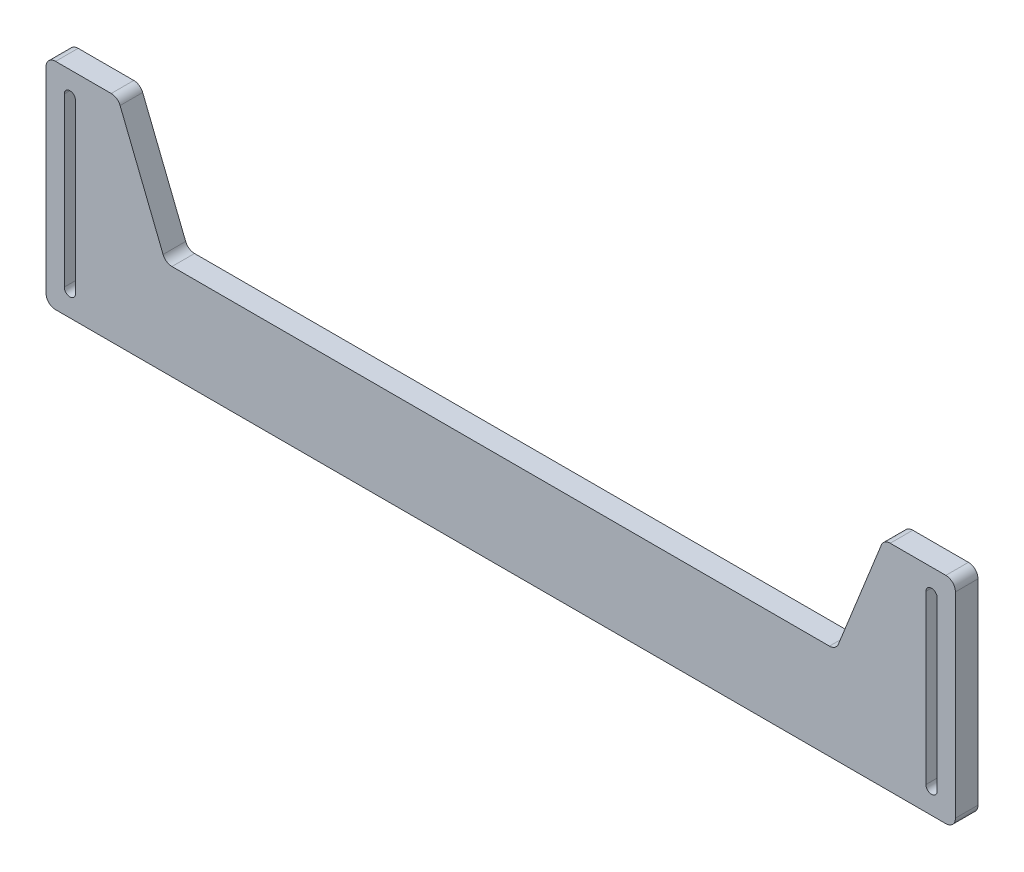
ISO-10303-21;
HEADER;
FILE_DESCRIPTION(('STEP AP214'),'2;1');
FILE_NAME('part.step','',(''),(''),'','','');
FILE_SCHEMA(('AUTOMOTIVE_DESIGN { 1 0 10303 214 1 1 1 1 }'));
ENDSEC;
DATA;
#1=APPLICATION_CONTEXT('core data for automotive mechanical design processes');
#2=APPLICATION_PROTOCOL_DEFINITION('international standard','automotive_design',2000,#1);
#3=PRODUCT_CONTEXT('',#1,'mechanical');
#4=PRODUCT('Part','Part','',(#3));
#5=PRODUCT_RELATED_PRODUCT_CATEGORY('part','',(#4));
#6=PRODUCT_DEFINITION_FORMATION('','',#4);
#7=PRODUCT_DEFINITION_CONTEXT('part definition',#1,'design');
#8=PRODUCT_DEFINITION('design','',#6,#7);
#9=PRODUCT_DEFINITION_SHAPE('','',#8);
#10=(LENGTH_UNIT() NAMED_UNIT(*) SI_UNIT(.MILLI.,.METRE.));
#11=(NAMED_UNIT(*) PLANE_ANGLE_UNIT() SI_UNIT($,.RADIAN.));
#12=(NAMED_UNIT(*) SI_UNIT($,.STERADIAN.) SOLID_ANGLE_UNIT());
#13=UNCERTAINTY_MEASURE_WITH_UNIT(LENGTH_MEASURE(1.E-05),#10,'distance_accuracy_value','');
#14=(GEOMETRIC_REPRESENTATION_CONTEXT(3) GLOBAL_UNCERTAINTY_ASSIGNED_CONTEXT((#13)) GLOBAL_UNIT_ASSIGNED_CONTEXT((#10,
#11,#12)) REPRESENTATION_CONTEXT('',''));
#15=CARTESIAN_POINT('',(0.,0.,0.));
#16=DIRECTION('',(0.,0.,1.));
#17=DIRECTION('',(1.,0.,0.));
#18=AXIS2_PLACEMENT_3D('',#15,#16,#17);
#19=CARTESIAN_POINT('',(0.,0.,3.));
#20=DIRECTION('',(0.,0.,-1.));
#21=DIRECTION('',(-1.,0.,0.));
#22=AXIS2_PLACEMENT_3D('',#19,#20,#21);
#23=PLANE('',#22);
#24=CARTESIAN_POINT('',(-114.475,22.225,3.));
#25=DIRECTION('',(0.,0.,1.));
#26=DIRECTION('',(1.,0.,0.));
#27=AXIS2_PLACEMENT_3D('',#24,#25,#26);
#28=CIRCLE('',#27,1.49999999999999);
#29=CARTESIAN_POINT('',(-112.975,22.225,3.));
#30=VERTEX_POINT('',#29);
#31=CARTESIAN_POINT('',(-115.975,22.225,3.));
#32=VERTEX_POINT('',#31);
#33=EDGE_CURVE('E515',#30,#32,#28,.T.);
#34=ORIENTED_EDGE('',*,*,#33,.F.);
#35=DIRECTION('',(0.,1.,0.));
#36=VECTOR('',#35,1.);
#37=CARTESIAN_POINT('',(-112.975,22.225,3.));
#38=LINE('',#37,#36);
#39=CARTESIAN_POINT('',(-112.975,-22.225,3.));
#40=VERTEX_POINT('',#39);
#41=EDGE_CURVE('E510',#40,#30,#38,.T.);
#42=ORIENTED_EDGE('',*,*,#41,.F.);
#43=CARTESIAN_POINT('',(-114.475,-22.225,3.));
#44=DIRECTION('',(0.,0.,1.));
#45=DIRECTION('',(1.,0.,0.));
#46=AXIS2_PLACEMENT_3D('',#43,#44,#45);
#47=CIRCLE('',#46,1.50000000000001);
#48=CARTESIAN_POINT('',(-115.975,-22.225,3.));
#49=VERTEX_POINT('',#48);
#50=EDGE_CURVE('E529',#49,#40,#47,.T.);
#51=ORIENTED_EDGE('',*,*,#50,.F.);
#52=DIRECTION('',(0.,-1.,0.));
#53=VECTOR('',#52,1.);
#54=CARTESIAN_POINT('',(-115.975,22.225,3.));
#55=LINE('',#54,#53);
#56=EDGE_CURVE('E536',#32,#49,#55,.T.);
#57=ORIENTED_EDGE('',*,*,#56,.F.);
#58=EDGE_LOOP('',(#34,#42,#51,#57));
#59=FACE_BOUND('',#58,.T.);
#60=DIRECTION('',(0.,1.,0.));
#61=VECTOR('',#60,1.);
#62=CARTESIAN_POINT('',(120.825,-28.575,3.));
#63=LINE('',#62,#61);
#64=CARTESIAN_POINT('',(120.825,-26.035,3.));
#65=VERTEX_POINT('',#64);
#66=CARTESIAN_POINT('',(120.825,26.035,3.));
#67=VERTEX_POINT('',#66);
#68=EDGE_CURVE('E260',#65,#67,#63,.T.);
#69=ORIENTED_EDGE('',*,*,#68,.T.);
#70=CARTESIAN_POINT('',(118.285,26.035,3.));
#71=DIRECTION('',(0.,0.,-1.));
#72=DIRECTION('',(-1.,0.,0.));
#73=AXIS2_PLACEMENT_3D('',#70,#71,#72);
#74=CIRCLE('',#73,2.54);
#75=CARTESIAN_POINT('',(118.285,28.575,3.));
#76=VERTEX_POINT('',#75);
#77=EDGE_CURVE('E373',#67,#76,#74,.F.);
#78=ORIENTED_EDGE('',*,*,#77,.T.);
#79=DIRECTION('',(-1.,0.,0.));
#80=VECTOR('',#79,1.);
#81=CARTESIAN_POINT('',(120.825,28.575,3.));
#82=LINE('',#81,#80);
#83=CARTESIAN_POINT('',(103.494663722024,28.575,3.));
#84=VERTEX_POINT('',#83);
#85=EDGE_CURVE('E280',#76,#84,#82,.T.);
#86=ORIENTED_EDGE('',*,*,#85,.T.);
#87=CARTESIAN_POINT('',(103.494663722024,26.035,3.));
#88=DIRECTION('',(0.,0.,-1.));
#89=DIRECTION('',(-1.,0.,0.));
#90=AXIS2_PLACEMENT_3D('',#87,#88,#89);
#91=CIRCLE('',#90,2.54);
#92=CARTESIAN_POINT('',(101.136332927176,26.9783323179394,3.));
#93=VERTEX_POINT('',#92);
#94=EDGE_CURVE('E384',#84,#93,#91,.F.);
#95=ORIENTED_EDGE('',*,*,#94,.T.);
#96=DIRECTION('',(-0.371390676354104,-0.928476690885259,0.));
#97=VECTOR('',#96,1.);
#98=CARTESIAN_POINT('',(101.775,28.575,3.));
#99=LINE('',#98,#97);
#100=CARTESIAN_POINT('',(89.7136670728242,-1.57833231793944,3.));
#101=VERTEX_POINT('',#100);
#102=EDGE_CURVE('E285',#93,#101,#99,.T.);
#103=ORIENTED_EDGE('',*,*,#102,.T.);
#104=CARTESIAN_POINT('',(87.3553362779756,-0.635000000000021,3.));
#105=DIRECTION('',(0.,0.,-1.));
#106=DIRECTION('',(-1.,0.,0.));
#107=AXIS2_PLACEMENT_3D('',#104,#105,#106);
#108=CIRCLE('',#107,2.54);
#109=CARTESIAN_POINT('',(87.3553362779756,-3.17500000000002,3.));
#110=VERTEX_POINT('',#109);
#111=EDGE_CURVE('E12',#101,#110,#108,.T.);
#112=ORIENTED_EDGE('',*,*,#111,.T.);
#113=DIRECTION('',(-1.,0.,0.));
#114=VECTOR('',#113,1.);
#115=CARTESIAN_POINT('',(-89.075,-3.17500000000002,3.));
#116=LINE('',#115,#114);
#117=CARTESIAN_POINT('',(-87.3553362779756,-3.17500000000002,3.));
#118=VERTEX_POINT('',#117);
#119=EDGE_CURVE('E293',#110,#118,#116,.T.);
#120=ORIENTED_EDGE('',*,*,#119,.T.);
#121=CARTESIAN_POINT('',(-87.3553362779756,-0.635000000000021,3.));
#122=DIRECTION('',(0.,0.,-1.));
#123=DIRECTION('',(-1.,0.,0.));
#124=AXIS2_PLACEMENT_3D('',#121,#122,#123);
#125=CIRCLE('',#124,2.54);
#126=CARTESIAN_POINT('',(-89.7136670728242,-1.57833231793944,3.));
#127=VERTEX_POINT('',#126);
#128=EDGE_CURVE('E304',#118,#127,#125,.T.);
#129=ORIENTED_EDGE('',*,*,#128,.T.);
#130=DIRECTION('',(-0.371390676354104,0.928476690885259,0.));
#131=VECTOR('',#130,1.);
#132=CARTESIAN_POINT('',(-101.775,28.575,3.));
#133=LINE('',#132,#131);
#134=CARTESIAN_POINT('',(-101.136332927176,26.9783323179394,3.));
#135=VERTEX_POINT('',#134);
#136=EDGE_CURVE('E298',#127,#135,#133,.T.);
#137=ORIENTED_EDGE('',*,*,#136,.T.);
#138=CARTESIAN_POINT('',(-103.494663722024,26.035,3.));
#139=DIRECTION('',(0.,0.,-1.));
#140=DIRECTION('',(-1.,0.,0.));
#141=AXIS2_PLACEMENT_3D('',#138,#139,#140);
#142=CIRCLE('',#141,2.54);
#143=CARTESIAN_POINT('',(-103.494663722024,28.575,3.));
#144=VERTEX_POINT('',#143);
#145=EDGE_CURVE('E381',#135,#144,#142,.F.);
#146=ORIENTED_EDGE('',*,*,#145,.T.);
#147=DIRECTION('',(-1.,0.,0.));
#148=VECTOR('',#147,1.);
#149=CARTESIAN_POINT('',(-120.825,28.575,3.));
#150=LINE('',#149,#148);
#151=CARTESIAN_POINT('',(-118.285,28.575,3.));
#152=VERTEX_POINT('',#151);
#153=EDGE_CURVE('E456',#144,#152,#150,.T.);
#154=ORIENTED_EDGE('',*,*,#153,.T.);
#155=CARTESIAN_POINT('',(-118.285,26.035,3.));
#156=DIRECTION('',(0.,0.,-1.));
#157=DIRECTION('',(-1.,0.,0.));
#158=AXIS2_PLACEMENT_3D('',#155,#156,#157);
#159=CIRCLE('',#158,2.54);
#160=CARTESIAN_POINT('',(-120.825,26.035,3.));
#161=VERTEX_POINT('',#160);
#162=EDGE_CURVE('E387',#152,#161,#159,.F.);
#163=ORIENTED_EDGE('',*,*,#162,.T.);
#164=DIRECTION('',(0.,-1.,0.));
#165=VECTOR('',#164,1.);
#166=CARTESIAN_POINT('',(-120.825,-28.575,3.));
#167=LINE('',#166,#165);
#168=CARTESIAN_POINT('',(-120.825,-26.035,3.));
#169=VERTEX_POINT('',#168);
#170=EDGE_CURVE('E261',#161,#169,#167,.T.);
#171=ORIENTED_EDGE('',*,*,#170,.T.);
#172=CARTESIAN_POINT('',(-118.285,-26.035,3.));
#173=DIRECTION('',(0.,0.,-1.));
#174=DIRECTION('',(-1.,0.,0.));
#175=AXIS2_PLACEMENT_3D('',#172,#173,#174);
#176=CIRCLE('',#175,2.54);
#177=CARTESIAN_POINT('',(-118.285,-28.575,3.));
#178=VERTEX_POINT('',#177);
#179=EDGE_CURVE('E72',#169,#178,#176,.F.);
#180=ORIENTED_EDGE('',*,*,#179,.T.);
#181=DIRECTION('',(1.,0.,0.));
#182=VECTOR('',#181,1.);
#183=CARTESIAN_POINT('',(-120.825,-28.575,3.));
#184=LINE('',#183,#182);
#185=CARTESIAN_POINT('',(118.285,-28.575,3.));
#186=VERTEX_POINT('',#185);
#187=EDGE_CURVE('E256',#178,#186,#184,.T.);
#188=ORIENTED_EDGE('',*,*,#187,.T.);
#189=CARTESIAN_POINT('',(118.285,-26.035,3.));
#190=DIRECTION('',(0.,0.,-1.));
#191=DIRECTION('',(-1.,0.,0.));
#192=AXIS2_PLACEMENT_3D('',#189,#190,#191);
#193=CIRCLE('',#192,2.54);
#194=EDGE_CURVE('E376',#186,#65,#193,.F.);
#195=ORIENTED_EDGE('',*,*,#194,.T.);
#196=EDGE_LOOP('',(#69,#78,#86,#95,#103,#112,#120,#129,#137,#146,#154,#163,#171,#180,#188,#195));
#197=FACE_BOUND('',#196,.T.);
#198=CARTESIAN_POINT('',(114.475,22.225,3.));
#199=DIRECTION('',(0.,0.,1.));
#200=DIRECTION('',(1.,0.,0.));
#201=AXIS2_PLACEMENT_3D('',#198,#199,#200);
#202=CIRCLE('',#201,1.49999999999999);
#203=CARTESIAN_POINT('',(115.975,22.225,3.));
#204=VERTEX_POINT('',#203);
#205=CARTESIAN_POINT('',(112.975,22.225,3.));
#206=VERTEX_POINT('',#205);
#207=EDGE_CURVE('E213',#204,#206,#202,.T.);
#208=ORIENTED_EDGE('',*,*,#207,.F.);
#209=DIRECTION('',(0.,1.,0.));
#210=VECTOR('',#209,1.);
#211=CARTESIAN_POINT('',(115.975,22.225,3.));
#212=LINE('',#211,#210);
#213=CARTESIAN_POINT('',(115.975,-22.225,3.));
#214=VERTEX_POINT('',#213);
#215=EDGE_CURVE('E241',#214,#204,#212,.T.);
#216=ORIENTED_EDGE('',*,*,#215,.F.);
#217=CARTESIAN_POINT('',(114.475,-22.225,3.));
#218=DIRECTION('',(0.,0.,1.));
#219=DIRECTION('',(1.,0.,0.));
#220=AXIS2_PLACEMENT_3D('',#217,#218,#219);
#221=CIRCLE('',#220,1.50000000000001);
#222=CARTESIAN_POINT('',(112.975,-22.225,3.));
#223=VERTEX_POINT('',#222);
#224=EDGE_CURVE('E238',#223,#214,#221,.T.);
#225=ORIENTED_EDGE('',*,*,#224,.F.);
#226=DIRECTION('',(0.,-1.,0.));
#227=VECTOR('',#226,1.);
#228=CARTESIAN_POINT('',(112.975,22.225,3.));
#229=LINE('',#228,#227);
#230=EDGE_CURVE('E224',#206,#223,#229,.T.);
#231=ORIENTED_EDGE('',*,*,#230,.F.);
#232=EDGE_LOOP('',(#208,#216,#225,#231));
#233=FACE_BOUND('',#232,.T.);
#234=ADVANCED_FACE('F48',(#59,#197,#233),#23,.F.);
#235=CARTESIAN_POINT('',(0.,0.,-3.));
#236=DIRECTION('',(0.,0.,-1.));
#237=DIRECTION('',(-1.,0.,0.));
#238=AXIS2_PLACEMENT_3D('',#235,#236,#237);
#239=PLANE('',#238);
#240=DIRECTION('',(-1.,0.,0.));
#241=VECTOR('',#240,1.);
#242=CARTESIAN_POINT('',(120.825,28.575,-3.));
#243=LINE('',#242,#241);
#244=CARTESIAN_POINT('',(118.285,28.575,-3.));
#245=VERTEX_POINT('',#244);
#246=CARTESIAN_POINT('',(103.494663722024,28.575,-3.));
#247=VERTEX_POINT('',#246);
#248=EDGE_CURVE('E269',#245,#247,#243,.T.);
#249=ORIENTED_EDGE('',*,*,#248,.F.);
#250=CARTESIAN_POINT('',(118.285,26.035,-3.));
#251=DIRECTION('',(0.,0.,-1.));
#252=DIRECTION('',(-1.,0.,0.));
#253=AXIS2_PLACEMENT_3D('',#250,#251,#252);
#254=CIRCLE('',#253,2.54);
#255=CARTESIAN_POINT('',(120.825,26.035,-3.));
#256=VERTEX_POINT('',#255);
#257=EDGE_CURVE('E397',#245,#256,#254,.T.);
#258=ORIENTED_EDGE('',*,*,#257,.T.);
#259=DIRECTION('',(0.,1.,0.));
#260=VECTOR('',#259,1.);
#261=CARTESIAN_POINT('',(120.825,-28.575,-3.));
#262=LINE('',#261,#260);
#263=CARTESIAN_POINT('',(120.825,-26.035,-3.));
#264=VERTEX_POINT('',#263);
#265=EDGE_CURVE('E286',#264,#256,#262,.T.);
#266=ORIENTED_EDGE('',*,*,#265,.F.);
#267=CARTESIAN_POINT('',(118.285,-26.035,-3.));
#268=DIRECTION('',(0.,0.,-1.));
#269=DIRECTION('',(-1.,0.,0.));
#270=AXIS2_PLACEMENT_3D('',#267,#268,#269);
#271=CIRCLE('',#270,2.54);
#272=CARTESIAN_POINT('',(118.285,-28.575,-3.));
#273=VERTEX_POINT('',#272);
#274=EDGE_CURVE('E400',#264,#273,#271,.T.);
#275=ORIENTED_EDGE('',*,*,#274,.T.);
#276=DIRECTION('',(1.,0.,0.));
#277=VECTOR('',#276,1.);
#278=CARTESIAN_POINT('',(-120.825,-28.575,-3.));
#279=LINE('',#278,#277);
#280=CARTESIAN_POINT('',(-118.285,-28.575,-3.));
#281=VERTEX_POINT('',#280);
#282=EDGE_CURVE('E424',#281,#273,#279,.T.);
#283=ORIENTED_EDGE('',*,*,#282,.F.);
#284=CARTESIAN_POINT('',(-118.285,-26.035,-3.));
#285=DIRECTION('',(0.,0.,-1.));
#286=DIRECTION('',(-1.,0.,0.));
#287=AXIS2_PLACEMENT_3D('',#284,#285,#286);
#288=CIRCLE('',#287,2.54);
#289=CARTESIAN_POINT('',(-120.825,-26.035,-3.));
#290=VERTEX_POINT('',#289);
#291=EDGE_CURVE('E403',#281,#290,#288,.T.);
#292=ORIENTED_EDGE('',*,*,#291,.T.);
#293=DIRECTION('',(0.,-1.,0.));
#294=VECTOR('',#293,1.);
#295=CARTESIAN_POINT('',(-120.825,-28.575,-3.));
#296=LINE('',#295,#294);
#297=CARTESIAN_POINT('',(-120.825,26.035,-3.));
#298=VERTEX_POINT('',#297);
#299=EDGE_CURVE('E427',#298,#290,#296,.T.);
#300=ORIENTED_EDGE('',*,*,#299,.F.);
#301=CARTESIAN_POINT('',(-118.285,26.035,-3.));
#302=DIRECTION('',(0.,0.,-1.));
#303=DIRECTION('',(-1.,0.,0.));
#304=AXIS2_PLACEMENT_3D('',#301,#302,#303);
#305=CIRCLE('',#304,2.54);
#306=CARTESIAN_POINT('',(-118.285,28.575,-3.));
#307=VERTEX_POINT('',#306);
#308=EDGE_CURVE('E412',#298,#307,#305,.T.);
#309=ORIENTED_EDGE('',*,*,#308,.T.);
#310=DIRECTION('',(-1.,0.,0.));
#311=VECTOR('',#310,1.);
#312=CARTESIAN_POINT('',(-120.825,28.575,-3.));
#313=LINE('',#312,#311);
#314=CARTESIAN_POINT('',(-103.494663722024,28.575,-3.));
#315=VERTEX_POINT('',#314);
#316=EDGE_CURVE('E431',#315,#307,#313,.T.);
#317=ORIENTED_EDGE('',*,*,#316,.F.);
#318=CARTESIAN_POINT('',(-103.494663722024,26.035,-3.));
#319=DIRECTION('',(0.,0.,-1.));
#320=DIRECTION('',(-1.,0.,0.));
#321=AXIS2_PLACEMENT_3D('',#318,#319,#320);
#322=CIRCLE('',#321,2.54);
#323=CARTESIAN_POINT('',(-101.136332927176,26.9783323179394,-3.));
#324=VERTEX_POINT('',#323);
#325=EDGE_CURVE('E406',#315,#324,#322,.T.);
#326=ORIENTED_EDGE('',*,*,#325,.T.);
#327=DIRECTION('',(-0.371390676354104,0.928476690885259,0.));
#328=VECTOR('',#327,1.);
#329=CARTESIAN_POINT('',(-101.775,28.575,-3.));
#330=LINE('',#329,#328);
#331=CARTESIAN_POINT('',(-89.7136670728242,-1.57833231793944,-3.));
#332=VERTEX_POINT('',#331);
#333=EDGE_CURVE('E435',#332,#324,#330,.T.);
#334=ORIENTED_EDGE('',*,*,#333,.F.);
#335=CARTESIAN_POINT('',(-87.3553362779756,-0.635000000000021,-3.));
#336=DIRECTION('',(0.,0.,-1.));
#337=DIRECTION('',(-1.,0.,0.));
#338=AXIS2_PLACEMENT_3D('',#335,#336,#337);
#339=CIRCLE('',#338,2.54);
#340=CARTESIAN_POINT('',(-87.3553362779756,-3.17500000000002,-3.));
#341=VERTEX_POINT('',#340);
#342=EDGE_CURVE('E308',#332,#341,#339,.F.);
#343=ORIENTED_EDGE('',*,*,#342,.T.);
#344=DIRECTION('',(-1.,0.,0.));
#345=VECTOR('',#344,1.);
#346=CARTESIAN_POINT('',(-89.075,-3.17500000000002,-3.));
#347=LINE('',#346,#345);
#348=CARTESIAN_POINT('',(87.3553362779756,-3.17500000000002,-3.));
#349=VERTEX_POINT('',#348);
#350=EDGE_CURVE('E320',#349,#341,#347,.T.);
#351=ORIENTED_EDGE('',*,*,#350,.F.);
#352=CARTESIAN_POINT('',(87.3553362779756,-0.635000000000021,-3.));
#353=DIRECTION('',(0.,0.,-1.));
#354=DIRECTION('',(-1.,0.,0.));
#355=AXIS2_PLACEMENT_3D('',#352,#353,#354);
#356=CIRCLE('',#355,2.54);
#357=CARTESIAN_POINT('',(89.7136670728242,-1.57833231793944,-3.));
#358=VERTEX_POINT('',#357);
#359=EDGE_CURVE('E58',#349,#358,#356,.F.);
#360=ORIENTED_EDGE('',*,*,#359,.T.);
#361=DIRECTION('',(-0.371390676354104,-0.928476690885259,0.));
#362=VECTOR('',#361,1.);
#363=CARTESIAN_POINT('',(101.775,28.575,-3.));
#364=LINE('',#363,#362);
#365=CARTESIAN_POINT('',(101.136332927176,26.9783323179394,-3.));
#366=VERTEX_POINT('',#365);
#367=EDGE_CURVE('E318',#366,#358,#364,.T.);
#368=ORIENTED_EDGE('',*,*,#367,.F.);
#369=CARTESIAN_POINT('',(103.494663722024,26.035,-3.));
#370=DIRECTION('',(0.,0.,-1.));
#371=DIRECTION('',(-1.,0.,0.));
#372=AXIS2_PLACEMENT_3D('',#369,#370,#371);
#373=CIRCLE('',#372,2.54);
#374=EDGE_CURVE('E409',#366,#247,#373,.T.);
#375=ORIENTED_EDGE('',*,*,#374,.T.);
#376=EDGE_LOOP('',(#249,#258,#266,#275,#283,#292,#300,#309,#317,#326,#334,#343,#351,#360,#368,#375));
#377=FACE_BOUND('',#376,.T.);
#378=DIRECTION('',(0.,1.,0.));
#379=VECTOR('',#378,1.);
#380=CARTESIAN_POINT('',(-112.975,22.225,-3.));
#381=LINE('',#380,#379);
#382=CARTESIAN_POINT('',(-112.975,-22.225,-3.));
#383=VERTEX_POINT('',#382);
#384=CARTESIAN_POINT('',(-112.975,22.225,-3.));
#385=VERTEX_POINT('',#384);
#386=EDGE_CURVE('E511',#383,#385,#381,.T.);
#387=ORIENTED_EDGE('',*,*,#386,.T.);
#388=CARTESIAN_POINT('',(-114.475,22.225,-3.));
#389=DIRECTION('',(0.,0.,1.));
#390=DIRECTION('',(1.,0.,0.));
#391=AXIS2_PLACEMENT_3D('',#388,#389,#390);
#392=CIRCLE('',#391,1.49999999999999);
#393=CARTESIAN_POINT('',(-115.975,22.225,-3.));
#394=VERTEX_POINT('',#393);
#395=EDGE_CURVE('E233',#385,#394,#392,.T.);
#396=ORIENTED_EDGE('',*,*,#395,.T.);
#397=DIRECTION('',(0.,-1.,0.));
#398=VECTOR('',#397,1.);
#399=CARTESIAN_POINT('',(-115.975,22.225,-3.));
#400=LINE('',#399,#398);
#401=CARTESIAN_POINT('',(-115.975,-22.225,-3.));
#402=VERTEX_POINT('',#401);
#403=EDGE_CURVE('E520',#394,#402,#400,.T.);
#404=ORIENTED_EDGE('',*,*,#403,.T.);
#405=CARTESIAN_POINT('',(-114.475,-22.225,-3.));
#406=DIRECTION('',(0.,0.,1.));
#407=DIRECTION('',(1.,0.,0.));
#408=AXIS2_PLACEMENT_3D('',#405,#406,#407);
#409=CIRCLE('',#408,1.50000000000001);
#410=EDGE_CURVE('E516',#402,#383,#409,.T.);
#411=ORIENTED_EDGE('',*,*,#410,.T.);
#412=EDGE_LOOP('',(#387,#396,#404,#411));
#413=FACE_BOUND('',#412,.T.);
#414=DIRECTION('',(0.,1.,0.));
#415=VECTOR('',#414,1.);
#416=CARTESIAN_POINT('',(115.975,22.225,-3.));
#417=LINE('',#416,#415);
#418=CARTESIAN_POINT('',(115.975,-22.225,-3.));
#419=VERTEX_POINT('',#418);
#420=CARTESIAN_POINT('',(115.975,22.225,-3.));
#421=VERTEX_POINT('',#420);
#422=EDGE_CURVE('E225',#419,#421,#417,.T.);
#423=ORIENTED_EDGE('',*,*,#422,.T.);
#424=CARTESIAN_POINT('',(114.475,22.225,-3.));
#425=DIRECTION('',(0.,0.,1.));
#426=DIRECTION('',(1.,0.,0.));
#427=AXIS2_PLACEMENT_3D('',#424,#425,#426);
#428=CIRCLE('',#427,1.49999999999999);
#429=CARTESIAN_POINT('',(112.975,22.225,-3.));
#430=VERTEX_POINT('',#429);
#431=EDGE_CURVE('E786',#421,#430,#428,.T.);
#432=ORIENTED_EDGE('',*,*,#431,.T.);
#433=DIRECTION('',(0.,-1.,0.));
#434=VECTOR('',#433,1.);
#435=CARTESIAN_POINT('',(112.975,22.225,-3.));
#436=LINE('',#435,#434);
#437=CARTESIAN_POINT('',(112.975,-22.225,-3.));
#438=VERTEX_POINT('',#437);
#439=EDGE_CURVE('E231',#430,#438,#436,.T.);
#440=ORIENTED_EDGE('',*,*,#439,.T.);
#441=CARTESIAN_POINT('',(114.475,-22.225,-3.));
#442=DIRECTION('',(0.,0.,1.));
#443=DIRECTION('',(1.,0.,0.));
#444=AXIS2_PLACEMENT_3D('',#441,#442,#443);
#445=CIRCLE('',#444,1.50000000000001);
#446=EDGE_CURVE('E780',#438,#419,#445,.T.);
#447=ORIENTED_EDGE('',*,*,#446,.T.);
#448=EDGE_LOOP('',(#423,#432,#440,#447));
#449=FACE_BOUND('',#448,.T.);
#450=ADVANCED_FACE('F316',(#377,#413,#449),#239,.T.);
#451=CARTESIAN_POINT('',(120.825,28.575,3.));
#452=DIRECTION('',(0.,-1.,0.));
#453=DIRECTION('',(0.,0.,-1.));
#454=AXIS2_PLACEMENT_3D('',#451,#452,#453);
#455=PLANE('',#454);
#456=ORIENTED_EDGE('',*,*,#85,.F.);
#457=DIRECTION('',(0.,0.,-1.));
#458=VECTOR('',#457,1.);
#459=CARTESIAN_POINT('',(118.285,28.575,3.));
#460=LINE('',#459,#458);
#461=EDGE_CURVE('E415',#76,#245,#460,.T.);
#462=ORIENTED_EDGE('',*,*,#461,.T.);
#463=ORIENTED_EDGE('',*,*,#248,.T.);
#464=DIRECTION('',(0.,0.,-1.));
#465=VECTOR('',#464,1.);
#466=CARTESIAN_POINT('',(103.494663722024,28.575,3.));
#467=LINE('',#466,#465);
#468=EDGE_CURVE('E268',#247,#84,#467,.F.);
#469=ORIENTED_EDGE('',*,*,#468,.T.);
#470=EDGE_LOOP('',(#456,#462,#463,#469));
#471=FACE_BOUND('',#470,.T.);
#472=ADVANCED_FACE('F489',(#471),#455,.F.);
#473=CARTESIAN_POINT('',(101.775,28.575,3.));
#474=DIRECTION('',(0.928476690885259,-0.371390676354104,0.));
#475=DIRECTION('',(0.371390676354104,0.928476690885259,0.));
#476=AXIS2_PLACEMENT_3D('',#473,#474,#475);
#477=PLANE('',#476);
#478=ORIENTED_EDGE('',*,*,#367,.T.);
#479=DIRECTION('',(0.,0.,-1.));
#480=VECTOR('',#479,1.);
#481=CARTESIAN_POINT('',(89.7136670728242,-1.57833231793945,3.));
#482=LINE('',#481,#480);
#483=EDGE_CURVE('E329',#358,#101,#482,.F.);
#484=ORIENTED_EDGE('',*,*,#483,.T.);
#485=ORIENTED_EDGE('',*,*,#102,.F.);
#486=DIRECTION('',(0.,0.,-1.));
#487=VECTOR('',#486,1.);
#488=CARTESIAN_POINT('',(101.136332927176,26.9783323179394,3.));
#489=LINE('',#488,#487);
#490=EDGE_CURVE('E331',#93,#366,#489,.T.);
#491=ORIENTED_EDGE('',*,*,#490,.T.);
#492=EDGE_LOOP('',(#478,#484,#485,#491));
#493=FACE_BOUND('',#492,.T.);
#494=ADVANCED_FACE('F327',(#493),#477,.F.);
#495=CARTESIAN_POINT('',(-89.075,-3.17500000000002,3.));
#496=DIRECTION('',(0.,-1.,0.));
#497=DIRECTION('',(0.,0.,-1.));
#498=AXIS2_PLACEMENT_3D('',#495,#496,#497);
#499=PLANE('',#498);
#500=ORIENTED_EDGE('',*,*,#350,.T.);
#501=DIRECTION('',(0.,0.,-1.));
#502=VECTOR('',#501,1.);
#503=CARTESIAN_POINT('',(-87.3553362779756,-3.17500000000002,3.));
#504=LINE('',#503,#502);
#505=EDGE_CURVE('E338',#341,#118,#504,.F.);
#506=ORIENTED_EDGE('',*,*,#505,.T.);
#507=ORIENTED_EDGE('',*,*,#119,.F.);
#508=DIRECTION('',(0.,0.,-1.));
#509=VECTOR('',#508,1.);
#510=CARTESIAN_POINT('',(87.3553362779756,-3.17500000000002,-3.));
#511=LINE('',#510,#509);
#512=EDGE_CURVE('E343',#110,#349,#511,.T.);
#513=ORIENTED_EDGE('',*,*,#512,.T.);
#514=EDGE_LOOP('',(#500,#506,#507,#513));
#515=FACE_BOUND('',#514,.T.);
#516=ADVANCED_FACE('F442',(#515),#499,.F.);
#517=CARTESIAN_POINT('',(-101.775,28.575,3.));
#518=DIRECTION('',(-0.928476690885259,-0.371390676354104,0.));
#519=DIRECTION('',(0.371390676354104,-0.928476690885259,0.));
#520=AXIS2_PLACEMENT_3D('',#517,#518,#519);
#521=PLANE('',#520);
#522=ORIENTED_EDGE('',*,*,#333,.T.);
#523=DIRECTION('',(0.,0.,-1.));
#524=VECTOR('',#523,1.);
#525=CARTESIAN_POINT('',(-101.136332927176,26.9783323179394,3.));
#526=LINE('',#525,#524);
#527=EDGE_CURVE('E346',#324,#135,#526,.F.);
#528=ORIENTED_EDGE('',*,*,#527,.T.);
#529=ORIENTED_EDGE('',*,*,#136,.F.);
#530=DIRECTION('',(0.,0.,-1.));
#531=VECTOR('',#530,1.);
#532=CARTESIAN_POINT('',(-89.7136670728242,-1.57833231793945,-3.));
#533=LINE('',#532,#531);
#534=EDGE_CURVE('E349',#127,#332,#533,.T.);
#535=ORIENTED_EDGE('',*,*,#534,.T.);
#536=EDGE_LOOP('',(#522,#528,#529,#535));
#537=FACE_BOUND('',#536,.T.);
#538=ADVANCED_FACE('F452',(#537),#521,.F.);
#539=CARTESIAN_POINT('',(-120.825,28.575,3.));
#540=DIRECTION('',(0.,-1.,0.));
#541=DIRECTION('',(0.,0.,-1.));
#542=AXIS2_PLACEMENT_3D('',#539,#540,#541);
#543=PLANE('',#542);
#544=ORIENTED_EDGE('',*,*,#153,.F.);
#545=DIRECTION('',(0.,0.,-1.));
#546=VECTOR('',#545,1.);
#547=CARTESIAN_POINT('',(-103.494663722024,28.575,3.));
#548=LINE('',#547,#546);
#549=EDGE_CURVE('E353',#144,#315,#548,.T.);
#550=ORIENTED_EDGE('',*,*,#549,.T.);
#551=ORIENTED_EDGE('',*,*,#316,.T.);
#552=DIRECTION('',(0.,0.,-1.));
#553=VECTOR('',#552,1.);
#554=CARTESIAN_POINT('',(-118.285,28.575,3.));
#555=LINE('',#554,#553);
#556=EDGE_CURVE('E357',#307,#152,#555,.F.);
#557=ORIENTED_EDGE('',*,*,#556,.T.);
#558=EDGE_LOOP('',(#544,#550,#551,#557));
#559=FACE_BOUND('',#558,.T.);
#560=ADVANCED_FACE('F579',(#559),#543,.F.);
#561=CARTESIAN_POINT('',(-120.825,-28.575,3.));
#562=DIRECTION('',(1.,0.,0.));
#563=DIRECTION('',(0.,0.,-1.));
#564=AXIS2_PLACEMENT_3D('',#561,#562,#563);
#565=PLANE('',#564);
#566=ORIENTED_EDGE('',*,*,#299,.T.);
#567=DIRECTION('',(0.,0.,-1.));
#568=VECTOR('',#567,1.);
#569=CARTESIAN_POINT('',(-120.825,-26.035,3.));
#570=LINE('',#569,#568);
#571=EDGE_CURVE('E360',#290,#169,#570,.F.);
#572=ORIENTED_EDGE('',*,*,#571,.T.);
#573=ORIENTED_EDGE('',*,*,#170,.F.);
#574=DIRECTION('',(0.,0.,-1.));
#575=VECTOR('',#574,1.);
#576=CARTESIAN_POINT('',(-120.825,26.035,3.));
#577=LINE('',#576,#575);
#578=EDGE_CURVE('E363',#161,#298,#577,.T.);
#579=ORIENTED_EDGE('',*,*,#578,.T.);
#580=EDGE_LOOP('',(#566,#572,#573,#579));
#581=FACE_BOUND('',#580,.T.);
#582=ADVANCED_FACE('F576',(#581),#565,.F.);
#583=CARTESIAN_POINT('',(-120.825,-28.575,3.));
#584=DIRECTION('',(0.,1.,0.));
#585=DIRECTION('',(0.,0.,1.));
#586=AXIS2_PLACEMENT_3D('',#583,#584,#585);
#587=PLANE('',#586);
#588=ORIENTED_EDGE('',*,*,#282,.T.);
#589=DIRECTION('',(0.,0.,-1.));
#590=VECTOR('',#589,1.);
#591=CARTESIAN_POINT('',(118.285,-28.575,3.));
#592=LINE('',#591,#590);
#593=EDGE_CURVE('E65',#273,#186,#592,.F.);
#594=ORIENTED_EDGE('',*,*,#593,.T.);
#595=ORIENTED_EDGE('',*,*,#187,.F.);
#596=DIRECTION('',(0.,0.,-1.));
#597=VECTOR('',#596,1.);
#598=CARTESIAN_POINT('',(-118.285,-28.575,3.));
#599=LINE('',#598,#597);
#600=EDGE_CURVE('E369',#178,#281,#599,.T.);
#601=ORIENTED_EDGE('',*,*,#600,.T.);
#602=EDGE_LOOP('',(#588,#594,#595,#601));
#603=FACE_BOUND('',#602,.T.);
#604=ADVANCED_FACE('F471',(#603),#587,.F.);
#605=CARTESIAN_POINT('',(120.825,-28.575,3.));
#606=DIRECTION('',(-1.,0.,0.));
#607=DIRECTION('',(0.,0.,1.));
#608=AXIS2_PLACEMENT_3D('',#605,#606,#607);
#609=PLANE('',#608);
#610=ORIENTED_EDGE('',*,*,#265,.T.);
#611=DIRECTION('',(0.,0.,-1.));
#612=VECTOR('',#611,1.);
#613=CARTESIAN_POINT('',(120.825,26.035,3.));
#614=LINE('',#613,#612);
#615=EDGE_CURVE('E390',#256,#67,#614,.F.);
#616=ORIENTED_EDGE('',*,*,#615,.T.);
#617=ORIENTED_EDGE('',*,*,#68,.F.);
#618=DIRECTION('',(0.,0.,-1.));
#619=VECTOR('',#618,1.);
#620=CARTESIAN_POINT('',(120.825,-26.035,3.));
#621=LINE('',#620,#619);
#622=EDGE_CURVE('E393',#65,#264,#621,.T.);
#623=ORIENTED_EDGE('',*,*,#622,.T.);
#624=EDGE_LOOP('',(#610,#616,#617,#623));
#625=FACE_BOUND('',#624,.T.);
#626=ADVANCED_FACE('F480',(#625),#609,.F.);
#627=CARTESIAN_POINT('',(-114.475,22.225,3.));
#628=DIRECTION('',(0.,0.,-1.));
#629=DIRECTION('',(-1.,0.,0.));
#630=AXIS2_PLACEMENT_3D('',#627,#628,#629);
#631=CYLINDRICAL_SURFACE('',#630,1.49999999999999);
#632=ORIENTED_EDGE('',*,*,#395,.F.);
#633=DIRECTION('',(0.,0.,-1.));
#634=VECTOR('',#633,1.);
#635=CARTESIAN_POINT('',(-112.975,22.225,3.));
#636=LINE('',#635,#634);
#637=EDGE_CURVE('E504',#30,#385,#636,.T.);
#638=ORIENTED_EDGE('',*,*,#637,.F.);
#639=ORIENTED_EDGE('',*,*,#33,.T.);
#640=DIRECTION('',(0.,0.,-1.));
#641=VECTOR('',#640,1.);
#642=CARTESIAN_POINT('',(-115.975,22.225,3.));
#643=LINE('',#642,#641);
#644=EDGE_CURVE('E287',#32,#394,#643,.T.);
#645=ORIENTED_EDGE('',*,*,#644,.T.);
#646=EDGE_LOOP('',(#632,#638,#639,#645));
#647=FACE_BOUND('',#646,.T.);
#648=ADVANCED_FACE('F553',(#647),#631,.F.);
#649=CARTESIAN_POINT('',(-115.975,22.225,3.));
#650=DIRECTION('',(1.,0.,0.));
#651=DIRECTION('',(0.,1.,0.));
#652=AXIS2_PLACEMENT_3D('',#649,#650,#651);
#653=PLANE('',#652);
#654=ORIENTED_EDGE('',*,*,#403,.F.);
#655=ORIENTED_EDGE('',*,*,#644,.F.);
#656=ORIENTED_EDGE('',*,*,#56,.T.);
#657=DIRECTION('',(0.,0.,-1.));
#658=VECTOR('',#657,1.);
#659=CARTESIAN_POINT('',(-115.975,-22.225,3.));
#660=LINE('',#659,#658);
#661=EDGE_CURVE('E494',#49,#402,#660,.T.);
#662=ORIENTED_EDGE('',*,*,#661,.T.);
#663=EDGE_LOOP('',(#654,#655,#656,#662));
#664=FACE_BOUND('',#663,.T.);
#665=ADVANCED_FACE('F555',(#664),#653,.T.);
#666=CARTESIAN_POINT('',(-114.475,-22.225,3.));
#667=DIRECTION('',(0.,0.,-1.));
#668=DIRECTION('',(-1.,0.,0.));
#669=AXIS2_PLACEMENT_3D('',#666,#667,#668);
#670=CYLINDRICAL_SURFACE('',#669,1.50000000000001);
#671=ORIENTED_EDGE('',*,*,#410,.F.);
#672=ORIENTED_EDGE('',*,*,#661,.F.);
#673=ORIENTED_EDGE('',*,*,#50,.T.);
#674=DIRECTION('',(0.,0.,-1.));
#675=VECTOR('',#674,1.);
#676=CARTESIAN_POINT('',(-112.975,-22.225,3.));
#677=LINE('',#676,#675);
#678=EDGE_CURVE('E499',#40,#383,#677,.T.);
#679=ORIENTED_EDGE('',*,*,#678,.T.);
#680=EDGE_LOOP('',(#671,#672,#673,#679));
#681=FACE_BOUND('',#680,.T.);
#682=ADVANCED_FACE('F546',(#681),#670,.F.);
#683=CARTESIAN_POINT('',(-112.975,22.225,3.));
#684=DIRECTION('',(-1.,0.,0.));
#685=DIRECTION('',(0.,-1.,0.));
#686=AXIS2_PLACEMENT_3D('',#683,#684,#685);
#687=PLANE('',#686);
#688=ORIENTED_EDGE('',*,*,#386,.F.);
#689=ORIENTED_EDGE('',*,*,#678,.F.);
#690=ORIENTED_EDGE('',*,*,#41,.T.);
#691=ORIENTED_EDGE('',*,*,#637,.T.);
#692=EDGE_LOOP('',(#688,#689,#690,#691));
#693=FACE_BOUND('',#692,.T.);
#694=ADVANCED_FACE('F552',(#693),#687,.T.);
#695=CARTESIAN_POINT('',(114.475,22.225,3.));
#696=DIRECTION('',(0.,0.,-1.));
#697=DIRECTION('',(-1.,0.,0.));
#698=AXIS2_PLACEMENT_3D('',#695,#696,#697);
#699=CYLINDRICAL_SURFACE('',#698,1.49999999999999);
#700=ORIENTED_EDGE('',*,*,#431,.F.);
#701=DIRECTION('',(0.,0.,-1.));
#702=VECTOR('',#701,1.);
#703=CARTESIAN_POINT('',(115.975,22.225,3.));
#704=LINE('',#703,#702);
#705=EDGE_CURVE('E219',#204,#421,#704,.T.);
#706=ORIENTED_EDGE('',*,*,#705,.F.);
#707=ORIENTED_EDGE('',*,*,#207,.T.);
#708=DIRECTION('',(0.,0.,-1.));
#709=VECTOR('',#708,1.);
#710=CARTESIAN_POINT('',(112.975,22.225,3.));
#711=LINE('',#710,#709);
#712=EDGE_CURVE('E216',#206,#430,#711,.T.);
#713=ORIENTED_EDGE('',*,*,#712,.T.);
#714=EDGE_LOOP('',(#700,#706,#707,#713));
#715=FACE_BOUND('',#714,.T.);
#716=ADVANCED_FACE('F215',(#715),#699,.F.);
#717=CARTESIAN_POINT('',(112.975,22.225,3.));
#718=DIRECTION('',(1.,0.,0.));
#719=DIRECTION('',(0.,1.,0.));
#720=AXIS2_PLACEMENT_3D('',#717,#718,#719);
#721=PLANE('',#720);
#722=ORIENTED_EDGE('',*,*,#439,.F.);
#723=ORIENTED_EDGE('',*,*,#712,.F.);
#724=ORIENTED_EDGE('',*,*,#230,.T.);
#725=DIRECTION('',(0.,0.,-1.));
#726=VECTOR('',#725,1.);
#727=CARTESIAN_POINT('',(112.975,-22.225,3.));
#728=LINE('',#727,#726);
#729=EDGE_CURVE('E234',#223,#438,#728,.T.);
#730=ORIENTED_EDGE('',*,*,#729,.T.);
#731=EDGE_LOOP('',(#722,#723,#724,#730));
#732=FACE_BOUND('',#731,.T.);
#733=ADVANCED_FACE('F228',(#732),#721,.T.);
#734=CARTESIAN_POINT('',(114.475,-22.225,3.));
#735=DIRECTION('',(0.,0.,-1.));
#736=DIRECTION('',(-1.,0.,0.));
#737=AXIS2_PLACEMENT_3D('',#734,#735,#736);
#738=CYLINDRICAL_SURFACE('',#737,1.50000000000001);
#739=ORIENTED_EDGE('',*,*,#446,.F.);
#740=ORIENTED_EDGE('',*,*,#729,.F.);
#741=ORIENTED_EDGE('',*,*,#224,.T.);
#742=DIRECTION('',(0.,0.,-1.));
#743=VECTOR('',#742,1.);
#744=CARTESIAN_POINT('',(115.975,-22.225,3.));
#745=LINE('',#744,#743);
#746=EDGE_CURVE('E781',#214,#419,#745,.T.);
#747=ORIENTED_EDGE('',*,*,#746,.T.);
#748=EDGE_LOOP('',(#739,#740,#741,#747));
#749=FACE_BOUND('',#748,.T.);
#750=ADVANCED_FACE('F667',(#749),#738,.F.);
#751=CARTESIAN_POINT('',(115.975,22.225,3.));
#752=DIRECTION('',(-1.,0.,0.));
#753=DIRECTION('',(0.,-1.,0.));
#754=AXIS2_PLACEMENT_3D('',#751,#752,#753);
#755=PLANE('',#754);
#756=ORIENTED_EDGE('',*,*,#422,.F.);
#757=ORIENTED_EDGE('',*,*,#746,.F.);
#758=ORIENTED_EDGE('',*,*,#215,.T.);
#759=ORIENTED_EDGE('',*,*,#705,.T.);
#760=EDGE_LOOP('',(#756,#757,#758,#759));
#761=FACE_BOUND('',#760,.T.);
#762=ADVANCED_FACE('F593',(#761),#755,.T.);
#763=CARTESIAN_POINT('',(118.285,26.035,3.));
#764=DIRECTION('',(0.,0.,-1.));
#765=DIRECTION('',(-1.,0.,0.));
#766=AXIS2_PLACEMENT_3D('',#763,#764,#765);
#767=CYLINDRICAL_SURFACE('',#766,2.54);
#768=ORIENTED_EDGE('',*,*,#77,.F.);
#769=ORIENTED_EDGE('',*,*,#615,.F.);
#770=ORIENTED_EDGE('',*,*,#257,.F.);
#771=ORIENTED_EDGE('',*,*,#461,.F.);
#772=EDGE_LOOP('',(#768,#769,#770,#771));
#773=FACE_BOUND('',#772,.T.);
#774=ADVANCED_FACE('F486',(#773),#767,.T.);
#775=CARTESIAN_POINT('',(118.285,-26.035,3.));
#776=DIRECTION('',(0.,0.,-1.));
#777=DIRECTION('',(-1.,0.,0.));
#778=AXIS2_PLACEMENT_3D('',#775,#776,#777);
#779=CYLINDRICAL_SURFACE('',#778,2.54);
#780=ORIENTED_EDGE('',*,*,#194,.F.);
#781=ORIENTED_EDGE('',*,*,#593,.F.);
#782=ORIENTED_EDGE('',*,*,#274,.F.);
#783=ORIENTED_EDGE('',*,*,#622,.F.);
#784=EDGE_LOOP('',(#780,#781,#782,#783));
#785=FACE_BOUND('',#784,.T.);
#786=ADVANCED_FACE('F477',(#785),#779,.T.);
#787=CARTESIAN_POINT('',(-118.285,-26.035,3.));
#788=DIRECTION('',(0.,0.,-1.));
#789=DIRECTION('',(-1.,0.,0.));
#790=AXIS2_PLACEMENT_3D('',#787,#788,#789);
#791=CYLINDRICAL_SURFACE('',#790,2.54);
#792=ORIENTED_EDGE('',*,*,#179,.F.);
#793=ORIENTED_EDGE('',*,*,#571,.F.);
#794=ORIENTED_EDGE('',*,*,#291,.F.);
#795=ORIENTED_EDGE('',*,*,#600,.F.);
#796=EDGE_LOOP('',(#792,#793,#794,#795));
#797=FACE_BOUND('',#796,.T.);
#798=ADVANCED_FACE('F469',(#797),#791,.T.);
#799=CARTESIAN_POINT('',(-103.494663722024,26.035,3.));
#800=DIRECTION('',(0.,0.,-1.));
#801=DIRECTION('',(-1.,0.,0.));
#802=AXIS2_PLACEMENT_3D('',#799,#800,#801);
#803=CYLINDRICAL_SURFACE('',#802,2.54);
#804=ORIENTED_EDGE('',*,*,#145,.F.);
#805=ORIENTED_EDGE('',*,*,#527,.F.);
#806=ORIENTED_EDGE('',*,*,#325,.F.);
#807=ORIENTED_EDGE('',*,*,#549,.F.);
#808=EDGE_LOOP('',(#804,#805,#806,#807));
#809=FACE_BOUND('',#808,.T.);
#810=ADVANCED_FACE('F598',(#809),#803,.T.);
#811=CARTESIAN_POINT('',(-87.3553362779756,-0.635000000000021,3.));
#812=DIRECTION('',(0.,0.,1.));
#813=DIRECTION('',(1.,0.,0.));
#814=AXIS2_PLACEMENT_3D('',#811,#812,#813);
#815=CYLINDRICAL_SURFACE('',#814,2.54);
#816=ORIENTED_EDGE('',*,*,#128,.F.);
#817=ORIENTED_EDGE('',*,*,#505,.F.);
#818=ORIENTED_EDGE('',*,*,#342,.F.);
#819=ORIENTED_EDGE('',*,*,#534,.F.);
#820=EDGE_LOOP('',(#816,#817,#818,#819));
#821=FACE_BOUND('',#820,.T.);
#822=ADVANCED_FACE('F446',(#821),#815,.F.);
#823=CARTESIAN_POINT('',(87.3553362779756,-0.635000000000021,3.));
#824=DIRECTION('',(0.,0.,1.));
#825=DIRECTION('',(1.,0.,0.));
#826=AXIS2_PLACEMENT_3D('',#823,#824,#825);
#827=CYLINDRICAL_SURFACE('',#826,2.54);
#828=ORIENTED_EDGE('',*,*,#111,.F.);
#829=ORIENTED_EDGE('',*,*,#483,.F.);
#830=ORIENTED_EDGE('',*,*,#359,.F.);
#831=ORIENTED_EDGE('',*,*,#512,.F.);
#832=EDGE_LOOP('',(#828,#829,#830,#831));
#833=FACE_BOUND('',#832,.T.);
#834=ADVANCED_FACE('F334',(#833),#827,.F.);
#835=CARTESIAN_POINT('',(103.494663722024,26.035,3.));
#836=DIRECTION('',(0.,0.,-1.));
#837=DIRECTION('',(-1.,0.,0.));
#838=AXIS2_PLACEMENT_3D('',#835,#836,#837);
#839=CYLINDRICAL_SURFACE('',#838,2.54);
#840=ORIENTED_EDGE('',*,*,#94,.F.);
#841=ORIENTED_EDGE('',*,*,#468,.F.);
#842=ORIENTED_EDGE('',*,*,#374,.F.);
#843=ORIENTED_EDGE('',*,*,#490,.F.);
#844=EDGE_LOOP('',(#840,#841,#842,#843));
#845=FACE_BOUND('',#844,.T.);
#846=ADVANCED_FACE('F605',(#845),#839,.T.);
#847=CARTESIAN_POINT('',(-118.285,26.035,3.));
#848=DIRECTION('',(0.,0.,-1.));
#849=DIRECTION('',(-1.,0.,0.));
#850=AXIS2_PLACEMENT_3D('',#847,#848,#849);
#851=CYLINDRICAL_SURFACE('',#850,2.54);
#852=ORIENTED_EDGE('',*,*,#162,.F.);
#853=ORIENTED_EDGE('',*,*,#556,.F.);
#854=ORIENTED_EDGE('',*,*,#308,.F.);
#855=ORIENTED_EDGE('',*,*,#578,.F.);
#856=EDGE_LOOP('',(#852,#853,#854,#855));
#857=FACE_BOUND('',#856,.T.);
#858=ADVANCED_FACE('F50',(#857),#851,.T.);
#859=CLOSED_SHELL('',(#234,#450,#472,#494,#516,#538,#560,#582,#604,#626,#648,#665,#682,#694,
#716,#733,#750,#762,#774,#786,#798,#810,#822,#834,#846,#858));
#860=MANIFOLD_SOLID_BREP('B2',#859);
#861=ADVANCED_BREP_SHAPE_REPRESENTATION('',(#18,#860),#14);
#862=SHAPE_DEFINITION_REPRESENTATION(#9,#861);
ENDSEC;
END-ISO-10303-21;
